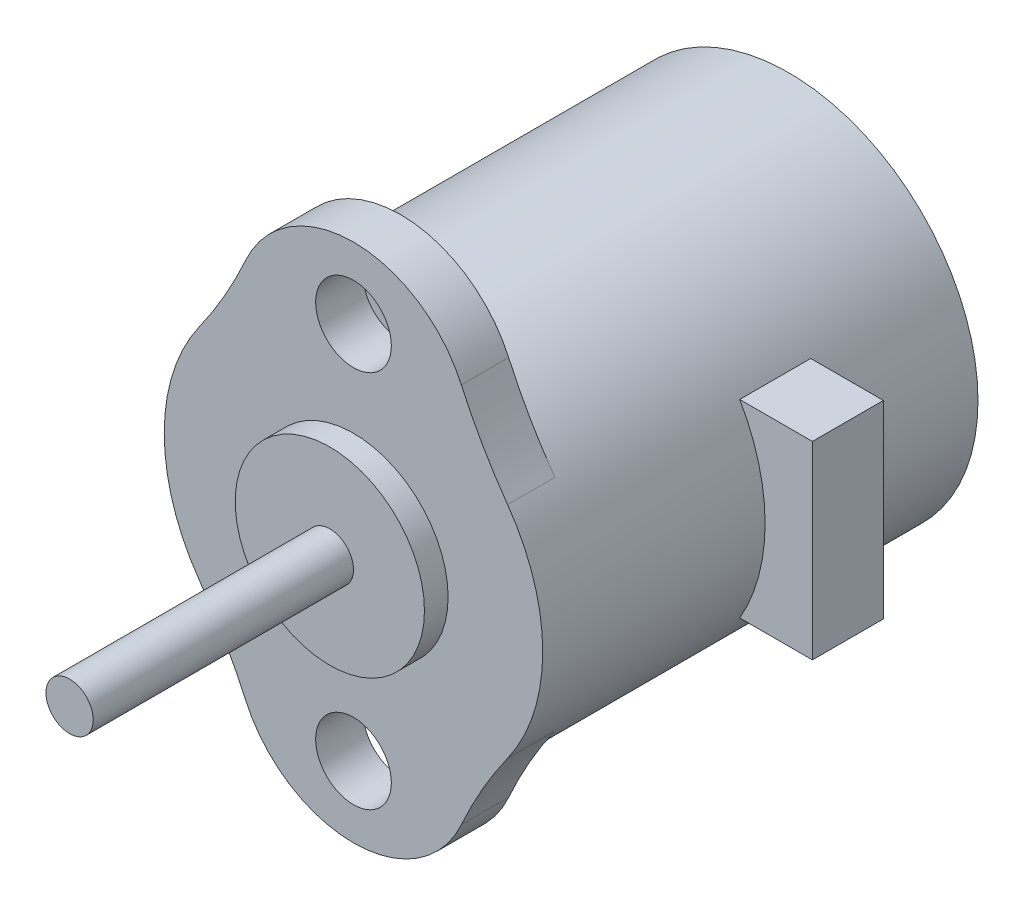
ISO-10303-21;
HEADER;
FILE_DESCRIPTION(('STEP AP214'),'2;1');
FILE_NAME('part.step','',(''),(''),'','','');
FILE_SCHEMA(('AUTOMOTIVE_DESIGN { 1 0 10303 214 1 1 1 1 }'));
ENDSEC;
DATA;
#1=APPLICATION_CONTEXT('core data for automotive mechanical design processes');
#2=APPLICATION_PROTOCOL_DEFINITION('international standard','automotive_design',2000,#1);
#3=PRODUCT_CONTEXT('',#1,'mechanical');
#4=PRODUCT('Part','Part','',(#3));
#5=PRODUCT_RELATED_PRODUCT_CATEGORY('part','',(#4));
#6=PRODUCT_DEFINITION_FORMATION('','',#4);
#7=PRODUCT_DEFINITION_CONTEXT('part definition',#1,'design');
#8=PRODUCT_DEFINITION('design','',#6,#7);
#9=PRODUCT_DEFINITION_SHAPE('','',#8);
#10=(LENGTH_UNIT() NAMED_UNIT(*) SI_UNIT(.MILLI.,.METRE.));
#11=(NAMED_UNIT(*) PLANE_ANGLE_UNIT() SI_UNIT($,.RADIAN.));
#12=(NAMED_UNIT(*) SI_UNIT($,.STERADIAN.) SOLID_ANGLE_UNIT());
#13=UNCERTAINTY_MEASURE_WITH_UNIT(LENGTH_MEASURE(1.E-05),#10,'distance_accuracy_value','');
#14=(GEOMETRIC_REPRESENTATION_CONTEXT(3) GLOBAL_UNCERTAINTY_ASSIGNED_CONTEXT((#13)) GLOBAL_UNIT_ASSIGNED_CONTEXT((#10,
#11,#12)) REPRESENTATION_CONTEXT('',''));
#15=CARTESIAN_POINT('',(0.,0.,0.));
#16=DIRECTION('',(0.,0.,1.));
#17=DIRECTION('',(1.,0.,0.));
#18=AXIS2_PLACEMENT_3D('',#15,#16,#17);
#19=CARTESIAN_POINT('',(0.,0.,8.2));
#20=DIRECTION('',(0.,0.,1.));
#21=DIRECTION('',(1.,0.,0.));
#22=AXIS2_PLACEMENT_3D('',#19,#20,#21);
#23=PLANE('',#22);
#24=CARTESIAN_POINT('',(0.,-4.,8.2));
#25=DIRECTION('',(0.,0.,1.));
#26=DIRECTION('',(1.,0.,0.));
#27=AXIS2_PLACEMENT_3D('',#24,#25,#26);
#28=CIRCLE('',#27,0.8);
#29=CARTESIAN_POINT('',(0.795989949685296,-3.92,8.2));
#30=VERTEX_POINT('',#29);
#31=CARTESIAN_POINT('',(-0.795989949685296,-3.92,8.2));
#32=VERTEX_POINT('',#31);
#33=EDGE_CURVE('E172',#30,#32,#28,.T.);
#34=ORIENTED_EDGE('',*,*,#33,.T.);
#35=CARTESIAN_POINT('',(0.,0.,8.2));
#36=DIRECTION('',(0.,0.,1.));
#37=DIRECTION('',(1.,0.,0.));
#38=AXIS2_PLACEMENT_3D('',#35,#36,#37);
#39=CIRCLE('',#38,4.);
#40=EDGE_CURVE('E149',#32,#30,#39,.T.);
#41=ORIENTED_EDGE('',*,*,#40,.T.);
#42=EDGE_LOOP('',(#34,#41));
#43=FACE_BOUND('',#42,.T.);
#44=ADVANCED_FACE('F39',(#43),#23,.T.);
#45=CARTESIAN_POINT('',(0.,4.,8.2));
#46=DIRECTION('',(0.,0.,1.));
#47=DIRECTION('',(1.,0.,0.));
#48=AXIS2_PLACEMENT_3D('',#45,#46,#47);
#49=CIRCLE('',#48,0.8);
#50=CARTESIAN_POINT('',(-0.795989949685296,3.92,8.2));
#51=VERTEX_POINT('',#50);
#52=CARTESIAN_POINT('',(0.795989949685296,3.92,8.2));
#53=VERTEX_POINT('',#52);
#54=EDGE_CURVE('E145',#51,#53,#49,.T.);
#55=ORIENTED_EDGE('',*,*,#54,.T.);
#56=EDGE_CURVE('E141',#53,#51,#39,.T.);
#57=ORIENTED_EDGE('',*,*,#56,.T.);
#58=EDGE_LOOP('',(#55,#57));
#59=FACE_BOUND('',#58,.T.);
#60=ADVANCED_FACE('F143',(#59),#23,.T.);
#61=CARTESIAN_POINT('',(0.,0.,8.2));
#62=DIRECTION('',(0.,0.,-1.));
#63=DIRECTION('',(-1.,0.,0.));
#64=AXIS2_PLACEMENT_3D('',#61,#62,#63);
#65=CYLINDRICAL_SURFACE('',#64,4.);
#66=CARTESIAN_POINT('',(0.,0.,0.));
#67=DIRECTION('',(0.,0.,1.));
#68=DIRECTION('',(1.,0.,0.));
#69=AXIS2_PLACEMENT_3D('',#66,#67,#68);
#70=CIRCLE('',#69,4.);
#71=CARTESIAN_POINT('',(4.,0.,0.));
#72=VERTEX_POINT('',#71);
#73=EDGE_CURVE('E204',#72,#72,#70,.T.);
#74=ORIENTED_EDGE('',*,*,#73,.T.);
#75=EDGE_LOOP('',(#74));
#76=FACE_BOUND('',#75,.T.);
#77=CARTESIAN_POINT('',(0.,0.,9.2));
#78=DIRECTION('',(0.,0.,1.));
#79=DIRECTION('',(1.,0.,0.));
#80=AXIS2_PLACEMENT_3D('',#77,#78,#79);
#81=CIRCLE('',#80,4.);
#82=CARTESIAN_POINT('',(3.25744829394959,-2.32142857142857,9.2));
#83=VERTEX_POINT('',#82);
#84=CARTESIAN_POINT('',(3.25744829394959,2.32142857142857,9.2));
#85=VERTEX_POINT('',#84);
#86=EDGE_CURVE('E270',#83,#85,#81,.T.);
#87=ORIENTED_EDGE('',*,*,#86,.F.);
#88=DIRECTION('',(0.,0.,-1.));
#89=VECTOR('',#88,1.);
#90=CARTESIAN_POINT('',(3.25744829394959,-2.32142857142857,8.2));
#91=LINE('',#90,#89);
#92=CARTESIAN_POINT('',(3.25744829394959,-2.32142857142857,8.2));
#93=VERTEX_POINT('',#92);
#94=EDGE_CURVE('E225',#83,#93,#91,.T.);
#95=ORIENTED_EDGE('',*,*,#94,.T.);
#96=CARTESIAN_POINT('',(0.,0.,8.2));
#97=DIRECTION('',(0.,0.,1.));
#98=DIRECTION('',(1.,0.,0.));
#99=AXIS2_PLACEMENT_3D('',#96,#97,#98);
#100=CIRCLE('',#99,4.);
#101=EDGE_CURVE('E165',#30,#93,#100,.T.);
#102=ORIENTED_EDGE('',*,*,#101,.F.);
#103=ORIENTED_EDGE('',*,*,#40,.F.);
#104=CARTESIAN_POINT('',(-3.25744829394959,-2.32142857142857,8.2));
#105=VERTEX_POINT('',#104);
#106=EDGE_CURVE('E163',#105,#32,#100,.T.);
#107=ORIENTED_EDGE('',*,*,#106,.F.);
#108=DIRECTION('',(0.,0.,-1.));
#109=VECTOR('',#108,1.);
#110=CARTESIAN_POINT('',(-3.25744829394959,-2.32142857142857,8.2));
#111=LINE('',#110,#109);
#112=CARTESIAN_POINT('',(-3.25744829394959,-2.32142857142857,9.2));
#113=VERTEX_POINT('',#112);
#114=EDGE_CURVE('E220',#105,#113,#111,.F.);
#115=ORIENTED_EDGE('',*,*,#114,.T.);
#116=CARTESIAN_POINT('',(-3.25744829394959,2.32142857142857,9.2));
#117=VERTEX_POINT('',#116);
#118=EDGE_CURVE('E176',#117,#113,#81,.T.);
#119=ORIENTED_EDGE('',*,*,#118,.F.);
#120=DIRECTION('',(0.,0.,-1.));
#121=VECTOR('',#120,1.);
#122=CARTESIAN_POINT('',(-3.25744829394959,2.32142857142857,8.2));
#123=LINE('',#122,#121);
#124=CARTESIAN_POINT('',(-3.25744829394959,2.32142857142857,8.2));
#125=VERTEX_POINT('',#124);
#126=EDGE_CURVE('E159',#117,#125,#123,.T.);
#127=ORIENTED_EDGE('',*,*,#126,.T.);
#128=EDGE_CURVE('E152',#51,#125,#100,.T.);
#129=ORIENTED_EDGE('',*,*,#128,.F.);
#130=ORIENTED_EDGE('',*,*,#56,.F.);
#131=CARTESIAN_POINT('',(3.25744829394959,2.32142857142857,8.2));
#132=VERTEX_POINT('',#131);
#133=EDGE_CURVE('E148',#132,#53,#39,.T.);
#134=ORIENTED_EDGE('',*,*,#133,.F.);
#135=DIRECTION('',(0.,0.,-1.));
#136=VECTOR('',#135,1.);
#137=CARTESIAN_POINT('',(3.25744829394959,2.32142857142857,8.2));
#138=LINE('',#137,#136);
#139=EDGE_CURVE('E223',#132,#85,#138,.F.);
#140=ORIENTED_EDGE('',*,*,#139,.T.);
#141=EDGE_LOOP('',(#87,#95,#102,#103,#107,#115,#119,#127,#129,#130,#134,#140));
#142=FACE_BOUND('',#141,.T.);
#143=CARTESIAN_POINT('',(0.,0.,4.5));
#144=DIRECTION('',(0.,0.,-1.));
#145=DIRECTION('',(-1.,0.,0.));
#146=AXIS2_PLACEMENT_3D('',#143,#144,#145);
#147=CIRCLE('',#146,4.);
#148=CARTESIAN_POINT('',(3.46410161513776,2.,4.5));
#149=VERTEX_POINT('',#148);
#150=CARTESIAN_POINT('',(3.46410161513775,-2.,4.5));
#151=VERTEX_POINT('',#150);
#152=EDGE_CURVE('E217',#149,#151,#147,.T.);
#153=ORIENTED_EDGE('',*,*,#152,.F.);
#154=DIRECTION('',(0.,0.,-1.));
#155=VECTOR('',#154,1.);
#156=CARTESIAN_POINT('',(3.46410161513776,2.,8.2));
#157=LINE('',#156,#155);
#158=CARTESIAN_POINT('',(3.46410161513776,2.,3.));
#159=VERTEX_POINT('',#158);
#160=EDGE_CURVE('E206',#159,#149,#157,.F.);
#161=ORIENTED_EDGE('',*,*,#160,.F.);
#162=CARTESIAN_POINT('',(0.,0.,3.));
#163=DIRECTION('',(0.,0.,1.));
#164=DIRECTION('',(1.,0.,0.));
#165=AXIS2_PLACEMENT_3D('',#162,#163,#164);
#166=CIRCLE('',#165,4.);
#167=CARTESIAN_POINT('',(3.46410161513775,-2.,3.));
#168=VERTEX_POINT('',#167);
#169=EDGE_CURVE('E211',#168,#159,#166,.T.);
#170=ORIENTED_EDGE('',*,*,#169,.F.);
#171=DIRECTION('',(0.,0.,-1.));
#172=VECTOR('',#171,1.);
#173=CARTESIAN_POINT('',(3.46410161513775,-2.,8.2));
#174=LINE('',#173,#172);
#175=EDGE_CURVE('E214',#151,#168,#174,.T.);
#176=ORIENTED_EDGE('',*,*,#175,.F.);
#177=EDGE_LOOP('',(#153,#161,#170,#176));
#178=FACE_BOUND('',#177,.T.);
#179=ADVANCED_FACE('F155',(#76,#142,#178),#65,.T.);
#180=CARTESIAN_POINT('',(0.,0.,0.));
#181=DIRECTION('',(0.,0.,1.));
#182=DIRECTION('',(1.,0.,0.));
#183=AXIS2_PLACEMENT_3D('',#180,#181,#182);
#184=PLANE('',#183);
#185=ORIENTED_EDGE('',*,*,#73,.F.);
#186=EDGE_LOOP('',(#185));
#187=FACE_BOUND('',#186,.T.);
#188=ADVANCED_FACE('F317',(#187),#184,.F.);
#189=CARTESIAN_POINT('',(5.,-2.,3.));
#190=DIRECTION('',(0.,1.,0.));
#191=DIRECTION('',(0.,0.,1.));
#192=AXIS2_PLACEMENT_3D('',#189,#190,#191);
#193=PLANE('',#192);
#194=DIRECTION('',(-1.,0.,0.));
#195=VECTOR('',#194,1.);
#196=CARTESIAN_POINT('',(5.,-2.,4.5));
#197=LINE('',#196,#195);
#198=CARTESIAN_POINT('',(5.,-2.,4.5));
#199=VERTEX_POINT('',#198);
#200=EDGE_CURVE('E199',#199,#151,#197,.T.);
#201=ORIENTED_EDGE('',*,*,#200,.T.);
#202=ORIENTED_EDGE('',*,*,#175,.T.);
#203=DIRECTION('',(-1.,0.,0.));
#204=VECTOR('',#203,1.);
#205=CARTESIAN_POINT('',(5.,-2.,3.));
#206=LINE('',#205,#204);
#207=CARTESIAN_POINT('',(5.,-2.,3.));
#208=VERTEX_POINT('',#207);
#209=EDGE_CURVE('E196',#208,#168,#206,.T.);
#210=ORIENTED_EDGE('',*,*,#209,.F.);
#211=DIRECTION('',(0.,0.,-1.));
#212=VECTOR('',#211,1.);
#213=CARTESIAN_POINT('',(5.,-2.,3.));
#214=LINE('',#213,#212);
#215=EDGE_CURVE('E184',#199,#208,#214,.T.);
#216=ORIENTED_EDGE('',*,*,#215,.F.);
#217=EDGE_LOOP('',(#201,#202,#210,#216));
#218=FACE_BOUND('',#217,.T.);
#219=ADVANCED_FACE('F320',(#218),#193,.F.);
#220=CARTESIAN_POINT('',(5.,2.,3.));
#221=DIRECTION('',(0.,-1.,0.));
#222=DIRECTION('',(0.,0.,-1.));
#223=AXIS2_PLACEMENT_3D('',#220,#221,#222);
#224=PLANE('',#223);
#225=DIRECTION('',(-1.,0.,0.));
#226=VECTOR('',#225,1.);
#227=CARTESIAN_POINT('',(5.,2.,3.));
#228=LINE('',#227,#226);
#229=CARTESIAN_POINT('',(5.,2.,3.));
#230=VERTEX_POINT('',#229);
#231=EDGE_CURVE('E193',#230,#159,#228,.T.);
#232=ORIENTED_EDGE('',*,*,#231,.T.);
#233=ORIENTED_EDGE('',*,*,#160,.T.);
#234=DIRECTION('',(-1.,0.,0.));
#235=VECTOR('',#234,1.);
#236=CARTESIAN_POINT('',(5.,2.,4.5));
#237=LINE('',#236,#235);
#238=CARTESIAN_POINT('',(5.,2.,4.5));
#239=VERTEX_POINT('',#238);
#240=EDGE_CURVE('E190',#239,#149,#237,.T.);
#241=ORIENTED_EDGE('',*,*,#240,.F.);
#242=DIRECTION('',(0.,0.,1.));
#243=VECTOR('',#242,1.);
#244=CARTESIAN_POINT('',(5.,2.,3.));
#245=LINE('',#244,#243);
#246=EDGE_CURVE('E188',#230,#239,#245,.T.);
#247=ORIENTED_EDGE('',*,*,#246,.F.);
#248=EDGE_LOOP('',(#232,#233,#241,#247));
#249=FACE_BOUND('',#248,.T.);
#250=ADVANCED_FACE('F375',(#249),#224,.F.);
#251=CARTESIAN_POINT('',(5.,-2.,4.5));
#252=DIRECTION('',(0.,0.,-1.));
#253=DIRECTION('',(-1.,0.,0.));
#254=AXIS2_PLACEMENT_3D('',#251,#252,#253);
#255=PLANE('',#254);
#256=ORIENTED_EDGE('',*,*,#240,.T.);
#257=ORIENTED_EDGE('',*,*,#152,.T.);
#258=ORIENTED_EDGE('',*,*,#200,.F.);
#259=DIRECTION('',(0.,-1.,0.));
#260=VECTOR('',#259,1.);
#261=CARTESIAN_POINT('',(5.,-2.,4.5));
#262=LINE('',#261,#260);
#263=EDGE_CURVE('E162',#239,#199,#262,.T.);
#264=ORIENTED_EDGE('',*,*,#263,.F.);
#265=EDGE_LOOP('',(#256,#257,#258,#264));
#266=FACE_BOUND('',#265,.T.);
#267=ADVANCED_FACE('F339',(#266),#255,.F.);
#268=CARTESIAN_POINT('',(5.,-2.,3.));
#269=DIRECTION('',(0.,0.,1.));
#270=DIRECTION('',(1.,0.,0.));
#271=AXIS2_PLACEMENT_3D('',#268,#269,#270);
#272=PLANE('',#271);
#273=ORIENTED_EDGE('',*,*,#209,.T.);
#274=ORIENTED_EDGE('',*,*,#169,.T.);
#275=ORIENTED_EDGE('',*,*,#231,.F.);
#276=DIRECTION('',(0.,1.,0.));
#277=VECTOR('',#276,1.);
#278=CARTESIAN_POINT('',(5.,-2.,3.));
#279=LINE('',#278,#277);
#280=EDGE_CURVE('E186',#208,#230,#279,.T.);
#281=ORIENTED_EDGE('',*,*,#280,.F.);
#282=EDGE_LOOP('',(#273,#274,#275,#281));
#283=FACE_BOUND('',#282,.T.);
#284=ADVANCED_FACE('F373',(#283),#272,.F.);
#285=CARTESIAN_POINT('',(5.,0.,0.));
#286=DIRECTION('',(1.,0.,0.));
#287=DIRECTION('',(0.,0.,-1.));
#288=AXIS2_PLACEMENT_3D('',#285,#286,#287);
#289=PLANE('',#288);
#290=ORIENTED_EDGE('',*,*,#263,.T.);
#291=ORIENTED_EDGE('',*,*,#215,.T.);
#292=ORIENTED_EDGE('',*,*,#280,.T.);
#293=ORIENTED_EDGE('',*,*,#246,.T.);
#294=EDGE_LOOP('',(#290,#291,#292,#293));
#295=FACE_BOUND('',#294,.T.);
#296=ADVANCED_FACE('F363',(#295),#289,.T.);
#297=CARTESIAN_POINT('',(0.,0.,8.2));
#298=DIRECTION('',(0.,0.,1.));
#299=DIRECTION('',(1.,0.,0.));
#300=AXIS2_PLACEMENT_3D('',#297,#298,#299);
#301=PLANE('',#300);
#302=CARTESIAN_POINT('',(0.,3.,8.2));
#303=DIRECTION('',(0.,0.,1.));
#304=DIRECTION('',(1.,0.,0.));
#305=AXIS2_PLACEMENT_3D('',#302,#303,#304);
#306=CIRCLE('',#305,2.5);
#307=CARTESIAN_POINT('',(2.28021380576471,4.025,8.2));
#308=VERTEX_POINT('',#307);
#309=CARTESIAN_POINT('',(-2.28021380576471,4.025,8.2));
#310=VERTEX_POINT('',#309);
#311=EDGE_CURVE('E280',#308,#310,#306,.T.);
#312=ORIENTED_EDGE('',*,*,#311,.F.);
#313=CARTESIAN_POINT('',(11.4010690288236,8.125,8.2));
#314=DIRECTION('',(0.,0.,1.));
#315=DIRECTION('',(1.,0.,0.));
#316=AXIS2_PLACEMENT_3D('',#313,#314,#315);
#317=CIRCLE('',#316,10.);
#318=EDGE_CURVE('E241',#308,#132,#317,.T.);
#319=ORIENTED_EDGE('',*,*,#318,.T.);
#320=ORIENTED_EDGE('',*,*,#133,.T.);
#321=EDGE_CURVE('E167',#53,#51,#49,.T.);
#322=ORIENTED_EDGE('',*,*,#321,.T.);
#323=ORIENTED_EDGE('',*,*,#128,.T.);
#324=CARTESIAN_POINT('',(-11.4010690288236,8.12500000000001,8.2));
#325=DIRECTION('',(0.,0.,1.));
#326=DIRECTION('',(1.,0.,0.));
#327=AXIS2_PLACEMENT_3D('',#324,#325,#326);
#328=CIRCLE('',#327,10.);
#329=EDGE_CURVE('E244',#125,#310,#328,.T.);
#330=ORIENTED_EDGE('',*,*,#329,.T.);
#331=EDGE_LOOP('',(#312,#319,#320,#322,#323,#330));
#332=FACE_BOUND('',#331,.T.);
#333=ADVANCED_FACE('F169',(#332),#301,.F.);
#334=ORIENTED_EDGE('',*,*,#101,.T.);
#335=CARTESIAN_POINT('',(11.4010690288236,-8.12500000000001,8.2));
#336=DIRECTION('',(0.,0.,1.));
#337=DIRECTION('',(1.,0.,0.));
#338=AXIS2_PLACEMENT_3D('',#335,#336,#337);
#339=CIRCLE('',#338,10.);
#340=CARTESIAN_POINT('',(2.28021380576471,-4.025,8.2));
#341=VERTEX_POINT('',#340);
#342=EDGE_CURVE('E237',#93,#341,#339,.T.);
#343=ORIENTED_EDGE('',*,*,#342,.T.);
#344=CARTESIAN_POINT('',(0.,-3.,8.2));
#345=DIRECTION('',(0.,0.,1.));
#346=DIRECTION('',(1.,0.,0.));
#347=AXIS2_PLACEMENT_3D('',#344,#345,#346);
#348=CIRCLE('',#347,2.5);
#349=CARTESIAN_POINT('',(-2.28021380576471,-4.025,8.2));
#350=VERTEX_POINT('',#349);
#351=EDGE_CURVE('E257',#341,#350,#348,.F.);
#352=ORIENTED_EDGE('',*,*,#351,.T.);
#353=CARTESIAN_POINT('',(-11.4010690288236,-8.125,8.2));
#354=DIRECTION('',(0.,0.,1.));
#355=DIRECTION('',(1.,0.,0.));
#356=AXIS2_PLACEMENT_3D('',#353,#354,#355);
#357=CIRCLE('',#356,10.);
#358=EDGE_CURVE('E48',#350,#105,#357,.T.);
#359=ORIENTED_EDGE('',*,*,#358,.T.);
#360=ORIENTED_EDGE('',*,*,#106,.T.);
#361=EDGE_CURVE('E281',#32,#30,#28,.T.);
#362=ORIENTED_EDGE('',*,*,#361,.T.);
#363=EDGE_LOOP('',(#334,#343,#352,#359,#360,#362));
#364=FACE_BOUND('',#363,.T.);
#365=ADVANCED_FACE('F253',(#364),#301,.F.);
#366=CARTESIAN_POINT('',(0.,3.,9.2));
#367=DIRECTION('',(0.,0.,-1.));
#368=DIRECTION('',(-1.,0.,0.));
#369=AXIS2_PLACEMENT_3D('',#366,#367,#368);
#370=CYLINDRICAL_SURFACE('',#369,2.5);
#371=CARTESIAN_POINT('',(0.,3.,9.2));
#372=DIRECTION('',(0.,0.,1.));
#373=DIRECTION('',(1.,0.,0.));
#374=AXIS2_PLACEMENT_3D('',#371,#372,#373);
#375=CIRCLE('',#374,2.5);
#376=CARTESIAN_POINT('',(2.28021380576471,4.025,9.2));
#377=VERTEX_POINT('',#376);
#378=CARTESIAN_POINT('',(-2.28021380576471,4.025,9.2));
#379=VERTEX_POINT('',#378);
#380=EDGE_CURVE('E175',#377,#379,#375,.T.);
#381=ORIENTED_EDGE('',*,*,#380,.F.);
#382=DIRECTION('',(0.,0.,-1.));
#383=VECTOR('',#382,1.);
#384=CARTESIAN_POINT('',(2.28021380576471,4.025,9.2));
#385=LINE('',#384,#383);
#386=EDGE_CURVE('E234',#377,#308,#385,.T.);
#387=ORIENTED_EDGE('',*,*,#386,.T.);
#388=ORIENTED_EDGE('',*,*,#311,.T.);
#389=DIRECTION('',(0.,0.,-1.));
#390=VECTOR('',#389,1.);
#391=CARTESIAN_POINT('',(-2.28021380576471,4.025,9.2));
#392=LINE('',#391,#390);
#393=EDGE_CURVE('E55',#310,#379,#392,.F.);
#394=ORIENTED_EDGE('',*,*,#393,.T.);
#395=EDGE_LOOP('',(#381,#387,#388,#394));
#396=FACE_BOUND('',#395,.T.);
#397=ADVANCED_FACE('F298',(#396),#370,.T.);
#398=CARTESIAN_POINT('',(0.,-3.,9.2));
#399=DIRECTION('',(0.,0.,-1.));
#400=DIRECTION('',(-1.,0.,0.));
#401=AXIS2_PLACEMENT_3D('',#398,#399,#400);
#402=CYLINDRICAL_SURFACE('',#401,2.5);
#403=ORIENTED_EDGE('',*,*,#351,.F.);
#404=DIRECTION('',(0.,0.,-1.));
#405=VECTOR('',#404,1.);
#406=CARTESIAN_POINT('',(2.28021380576471,-4.025,9.2));
#407=LINE('',#406,#405);
#408=CARTESIAN_POINT('',(2.28021380576471,-4.025,9.2));
#409=VERTEX_POINT('',#408);
#410=EDGE_CURVE('E231',#341,#409,#407,.F.);
#411=ORIENTED_EDGE('',*,*,#410,.T.);
#412=CARTESIAN_POINT('',(0.,-3.,9.2));
#413=DIRECTION('',(0.,0.,1.));
#414=DIRECTION('',(1.,0.,0.));
#415=AXIS2_PLACEMENT_3D('',#412,#413,#414);
#416=CIRCLE('',#415,2.5);
#417=CARTESIAN_POINT('',(-2.28021380576471,-4.025,9.2));
#418=VERTEX_POINT('',#417);
#419=EDGE_CURVE('E268',#409,#418,#416,.F.);
#420=ORIENTED_EDGE('',*,*,#419,.T.);
#421=DIRECTION('',(0.,0.,-1.));
#422=VECTOR('',#421,1.);
#423=CARTESIAN_POINT('',(-2.28021380576471,-4.025,9.2));
#424=LINE('',#423,#422);
#425=EDGE_CURVE('E228',#418,#350,#424,.T.);
#426=ORIENTED_EDGE('',*,*,#425,.T.);
#427=EDGE_LOOP('',(#403,#411,#420,#426));
#428=FACE_BOUND('',#427,.T.);
#429=ADVANCED_FACE('F293',(#428),#402,.T.);
#430=CARTESIAN_POINT('',(0.,-4.,9.2));
#431=DIRECTION('',(0.,0.,-1.));
#432=DIRECTION('',(-1.,0.,0.));
#433=AXIS2_PLACEMENT_3D('',#430,#431,#432);
#434=CYLINDRICAL_SURFACE('',#433,0.8);
#435=CARTESIAN_POINT('',(0.,-4.,9.2));
#436=DIRECTION('',(0.,0.,1.));
#437=DIRECTION('',(1.,0.,0.));
#438=AXIS2_PLACEMENT_3D('',#435,#436,#437);
#439=CIRCLE('',#438,0.8);
#440=CARTESIAN_POINT('',(0.8,-4.,9.2));
#441=VERTEX_POINT('',#440);
#442=EDGE_CURVE('E272',#441,#441,#439,.T.);
#443=ORIENTED_EDGE('',*,*,#442,.T.);
#444=EDGE_LOOP('',(#443));
#445=FACE_BOUND('',#444,.T.);
#446=ORIENTED_EDGE('',*,*,#33,.F.);
#447=ORIENTED_EDGE('',*,*,#361,.F.);
#448=EDGE_LOOP('',(#446,#447));
#449=FACE_BOUND('',#448,.T.);
#450=ADVANCED_FACE('F334',(#445,#449),#434,.F.);
#451=CARTESIAN_POINT('',(0.,4.,9.2));
#452=DIRECTION('',(0.,0.,-1.));
#453=DIRECTION('',(-1.,0.,0.));
#454=AXIS2_PLACEMENT_3D('',#451,#452,#453);
#455=CYLINDRICAL_SURFACE('',#454,0.8);
#456=CARTESIAN_POINT('',(0.,4.,9.2));
#457=DIRECTION('',(0.,0.,1.));
#458=DIRECTION('',(1.,0.,0.));
#459=AXIS2_PLACEMENT_3D('',#456,#457,#458);
#460=CIRCLE('',#459,0.8);
#461=CARTESIAN_POINT('',(0.8,4.,9.2));
#462=VERTEX_POINT('',#461);
#463=EDGE_CURVE('E181',#462,#462,#460,.T.);
#464=ORIENTED_EDGE('',*,*,#463,.T.);
#465=EDGE_LOOP('',(#464));
#466=FACE_BOUND('',#465,.T.);
#467=ORIENTED_EDGE('',*,*,#54,.F.);
#468=ORIENTED_EDGE('',*,*,#321,.F.);
#469=EDGE_LOOP('',(#467,#468));
#470=FACE_BOUND('',#469,.T.);
#471=ADVANCED_FACE('F174',(#466,#470),#455,.F.);
#472=CARTESIAN_POINT('',(0.,0.,9.2));
#473=DIRECTION('',(0.,0.,1.));
#474=DIRECTION('',(1.,0.,0.));
#475=AXIS2_PLACEMENT_3D('',#472,#473,#474);
#476=PLANE('',#475);
#477=CARTESIAN_POINT('',(0.,0.,9.2));
#478=DIRECTION('',(0.,0.,1.));
#479=DIRECTION('',(1.,0.,0.));
#480=AXIS2_PLACEMENT_3D('',#477,#478,#479);
#481=CIRCLE('',#480,2.);
#482=CARTESIAN_POINT('',(2.,0.,9.2));
#483=VERTEX_POINT('',#482);
#484=EDGE_CURVE('E575',#483,#483,#481,.T.);
#485=ORIENTED_EDGE('',*,*,#484,.F.);
#486=EDGE_LOOP('',(#485));
#487=FACE_BOUND('',#486,.T.);
#488=ORIENTED_EDGE('',*,*,#86,.T.);
#489=CARTESIAN_POINT('',(11.4010690288236,8.125,9.2));
#490=DIRECTION('',(0.,0.,1.));
#491=DIRECTION('',(1.,0.,0.));
#492=AXIS2_PLACEMENT_3D('',#489,#490,#491);
#493=CIRCLE('',#492,10.);
#494=EDGE_CURVE('E62',#85,#377,#493,.F.);
#495=ORIENTED_EDGE('',*,*,#494,.T.);
#496=ORIENTED_EDGE('',*,*,#380,.T.);
#497=CARTESIAN_POINT('',(-11.4010690288236,8.12500000000001,9.2));
#498=DIRECTION('',(0.,0.,1.));
#499=DIRECTION('',(1.,0.,0.));
#500=AXIS2_PLACEMENT_3D('',#497,#498,#499);
#501=CIRCLE('',#500,10.);
#502=EDGE_CURVE('E246',#379,#117,#501,.F.);
#503=ORIENTED_EDGE('',*,*,#502,.T.);
#504=ORIENTED_EDGE('',*,*,#118,.T.);
#505=CARTESIAN_POINT('',(-11.4010690288236,-8.125,9.2));
#506=DIRECTION('',(0.,0.,1.));
#507=DIRECTION('',(1.,0.,0.));
#508=AXIS2_PLACEMENT_3D('',#505,#506,#507);
#509=CIRCLE('',#508,10.);
#510=EDGE_CURVE('E11',#113,#418,#509,.F.);
#511=ORIENTED_EDGE('',*,*,#510,.T.);
#512=ORIENTED_EDGE('',*,*,#419,.F.);
#513=CARTESIAN_POINT('',(11.4010690288236,-8.12500000000001,9.2));
#514=DIRECTION('',(0.,0.,1.));
#515=DIRECTION('',(1.,0.,0.));
#516=AXIS2_PLACEMENT_3D('',#513,#514,#515);
#517=CIRCLE('',#516,10.);
#518=EDGE_CURVE('E239',#409,#83,#517,.F.);
#519=ORIENTED_EDGE('',*,*,#518,.T.);
#520=EDGE_LOOP('',(#488,#495,#496,#503,#504,#511,#512,#519));
#521=FACE_BOUND('',#520,.T.);
#522=ORIENTED_EDGE('',*,*,#442,.F.);
#523=EDGE_LOOP('',(#522));
#524=FACE_BOUND('',#523,.T.);
#525=ORIENTED_EDGE('',*,*,#463,.F.);
#526=EDGE_LOOP('',(#525));
#527=FACE_BOUND('',#526,.T.);
#528=ADVANCED_FACE('F263',(#487,#521,#524,#527),#476,.T.);
#529=CARTESIAN_POINT('',(11.4010690288236,-8.12500000000001,9.2));
#530=DIRECTION('',(0.,0.,1.));
#531=DIRECTION('',(1.,0.,0.));
#532=AXIS2_PLACEMENT_3D('',#529,#530,#531);
#533=CYLINDRICAL_SURFACE('',#532,10.);
#534=ORIENTED_EDGE('',*,*,#518,.F.);
#535=ORIENTED_EDGE('',*,*,#410,.F.);
#536=ORIENTED_EDGE('',*,*,#342,.F.);
#537=ORIENTED_EDGE('',*,*,#94,.F.);
#538=EDGE_LOOP('',(#534,#535,#536,#537));
#539=FACE_BOUND('',#538,.T.);
#540=ADVANCED_FACE('F291',(#539),#533,.F.);
#541=CARTESIAN_POINT('',(11.4010690288236,8.125,8.2));
#542=DIRECTION('',(0.,0.,1.));
#543=DIRECTION('',(1.,0.,0.));
#544=AXIS2_PLACEMENT_3D('',#541,#542,#543);
#545=CYLINDRICAL_SURFACE('',#544,10.);
#546=ORIENTED_EDGE('',*,*,#494,.F.);
#547=ORIENTED_EDGE('',*,*,#139,.F.);
#548=ORIENTED_EDGE('',*,*,#318,.F.);
#549=ORIENTED_EDGE('',*,*,#386,.F.);
#550=EDGE_LOOP('',(#546,#547,#548,#549));
#551=FACE_BOUND('',#550,.T.);
#552=ADVANCED_FACE('F296',(#551),#545,.F.);
#553=CARTESIAN_POINT('',(-11.4010690288236,8.12500000000001,9.2));
#554=DIRECTION('',(0.,0.,1.));
#555=DIRECTION('',(1.,0.,0.));
#556=AXIS2_PLACEMENT_3D('',#553,#554,#555);
#557=CYLINDRICAL_SURFACE('',#556,10.);
#558=ORIENTED_EDGE('',*,*,#502,.F.);
#559=ORIENTED_EDGE('',*,*,#393,.F.);
#560=ORIENTED_EDGE('',*,*,#329,.F.);
#561=ORIENTED_EDGE('',*,*,#126,.F.);
#562=EDGE_LOOP('',(#558,#559,#560,#561));
#563=FACE_BOUND('',#562,.T.);
#564=ADVANCED_FACE('F300',(#563),#557,.F.);
#565=CARTESIAN_POINT('',(-11.4010690288236,-8.125,8.2));
#566=DIRECTION('',(0.,0.,1.));
#567=DIRECTION('',(1.,0.,0.));
#568=AXIS2_PLACEMENT_3D('',#565,#566,#567);
#569=CYLINDRICAL_SURFACE('',#568,10.);
#570=ORIENTED_EDGE('',*,*,#510,.F.);
#571=ORIENTED_EDGE('',*,*,#114,.F.);
#572=ORIENTED_EDGE('',*,*,#358,.F.);
#573=ORIENTED_EDGE('',*,*,#425,.F.);
#574=EDGE_LOOP('',(#570,#571,#572,#573));
#575=FACE_BOUND('',#574,.T.);
#576=ADVANCED_FACE('F41',(#575),#569,.F.);
#577=CARTESIAN_POINT('',(0.,0.,9.7));
#578=DIRECTION('',(0.,0.,-1.));
#579=DIRECTION('',(-1.,0.,0.));
#580=AXIS2_PLACEMENT_3D('',#577,#578,#579);
#581=CYLINDRICAL_SURFACE('',#580,2.);
#582=CARTESIAN_POINT('',(0.,0.,9.7));
#583=DIRECTION('',(0.,0.,1.));
#584=DIRECTION('',(1.,0.,0.));
#585=AXIS2_PLACEMENT_3D('',#582,#583,#584);
#586=CIRCLE('',#585,2.);
#587=CARTESIAN_POINT('',(2.,0.,9.7));
#588=VERTEX_POINT('',#587);
#589=EDGE_CURVE('E574',#588,#588,#586,.T.);
#590=ORIENTED_EDGE('',*,*,#589,.F.);
#591=EDGE_LOOP('',(#590));
#592=FACE_BOUND('',#591,.T.);
#593=ORIENTED_EDGE('',*,*,#484,.T.);
#594=EDGE_LOOP('',(#593));
#595=FACE_BOUND('',#594,.T.);
#596=ADVANCED_FACE('F306',(#592,#595),#581,.T.);
#597=CARTESIAN_POINT('',(0.,0.,9.7));
#598=DIRECTION('',(0.,0.,1.));
#599=DIRECTION('',(1.,0.,0.));
#600=AXIS2_PLACEMENT_3D('',#597,#598,#599);
#601=PLANE('',#600);
#602=CARTESIAN_POINT('',(0.,0.,9.7));
#603=DIRECTION('',(0.,0.,1.));
#604=DIRECTION('',(1.,0.,0.));
#605=AXIS2_PLACEMENT_3D('',#602,#603,#604);
#606=CIRCLE('',#605,0.5);
#607=CARTESIAN_POINT('',(0.5,0.,9.7));
#608=VERTEX_POINT('',#607);
#609=EDGE_CURVE('E43',#608,#608,#606,.T.);
#610=ORIENTED_EDGE('',*,*,#609,.F.);
#611=EDGE_LOOP('',(#610));
#612=FACE_BOUND('',#611,.T.);
#613=ORIENTED_EDGE('',*,*,#589,.T.);
#614=EDGE_LOOP('',(#613));
#615=FACE_BOUND('',#614,.T.);
#616=ADVANCED_FACE('F343',(#612,#615),#601,.T.);
#617=CARTESIAN_POINT('',(0.,0.,15.2));
#618=DIRECTION('',(0.,0.,1.));
#619=DIRECTION('',(1.,0.,0.));
#620=AXIS2_PLACEMENT_3D('',#617,#618,#619);
#621=PLANE('',#620);
#622=CARTESIAN_POINT('',(0.,0.,15.2));
#623=DIRECTION('',(0.,0.,1.));
#624=DIRECTION('',(1.,0.,0.));
#625=AXIS2_PLACEMENT_3D('',#622,#623,#624);
#626=CIRCLE('',#625,0.5);
#627=CARTESIAN_POINT('',(0.5,0.,15.2));
#628=VERTEX_POINT('',#627);
#629=EDGE_CURVE('E202',#628,#628,#626,.T.);
#630=ORIENTED_EDGE('',*,*,#629,.T.);
#631=EDGE_LOOP('',(#630));
#632=FACE_BOUND('',#631,.T.);
#633=ADVANCED_FACE('F341',(#632),#621,.T.);
#634=CARTESIAN_POINT('',(0.,0.,15.2));
#635=DIRECTION('',(0.,0.,-1.));
#636=DIRECTION('',(-1.,0.,0.));
#637=AXIS2_PLACEMENT_3D('',#634,#635,#636);
#638=CYLINDRICAL_SURFACE('',#637,0.5);
#639=ORIENTED_EDGE('',*,*,#609,.T.);
#640=EDGE_LOOP('',(#639));
#641=FACE_BOUND('',#640,.T.);
#642=ORIENTED_EDGE('',*,*,#629,.F.);
#643=EDGE_LOOP('',(#642));
#644=FACE_BOUND('',#643,.T.);
#645=ADVANCED_FACE('F315',(#641,#644),#638,.T.);
#646=CLOSED_SHELL('',(#44,#60,#179,#188,#219,#250,#267,#284,#296,#333,#365,#397,#429,#450,#471,
#528,#540,#552,#564,#576,#596,#616,#633,#645));
#647=MANIFOLD_SOLID_BREP('B2',#646);
#648=ADVANCED_BREP_SHAPE_REPRESENTATION('',(#18,#647),#14);
#649=SHAPE_DEFINITION_REPRESENTATION(#9,#648);
ENDSEC;
END-ISO-10303-21;
